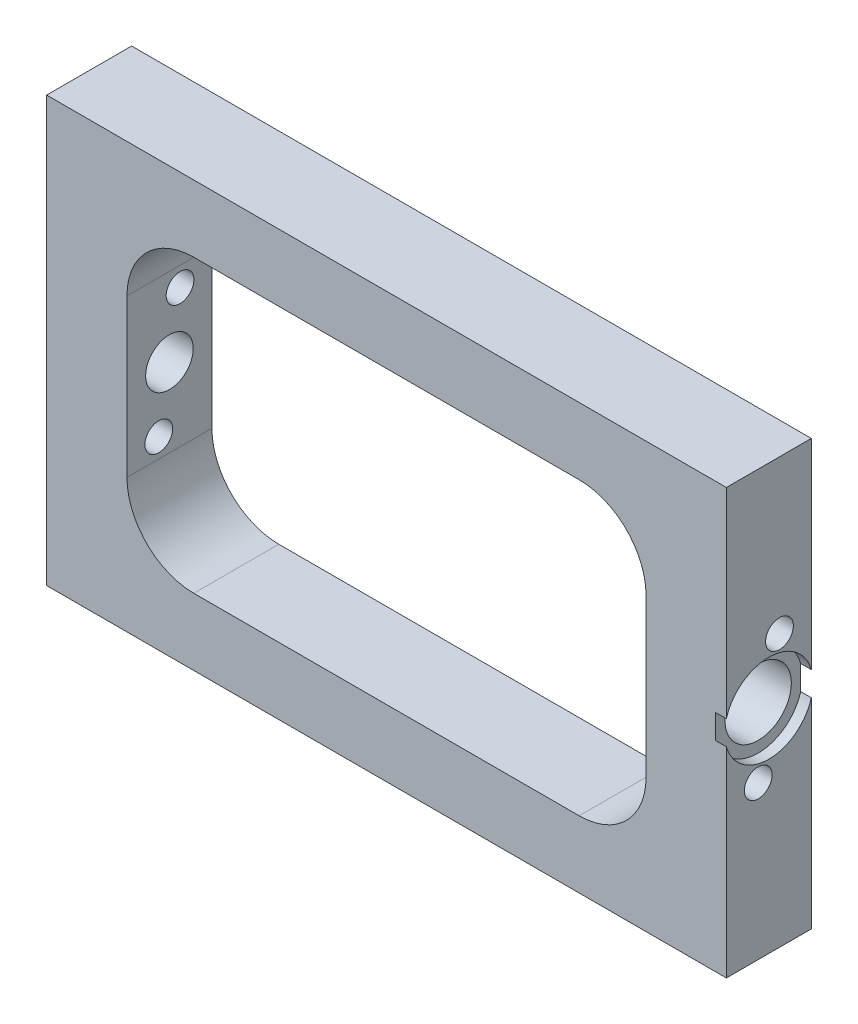
ISO-10303-21;
HEADER;
FILE_DESCRIPTION(('STEP AP214'),'2;1');
FILE_NAME('part.step','',(''),(''),'','','');
FILE_SCHEMA(('AUTOMOTIVE_DESIGN { 1 0 10303 214 1 1 1 1 }'));
ENDSEC;
DATA;
#1=APPLICATION_CONTEXT('core data for automotive mechanical design processes');
#2=APPLICATION_PROTOCOL_DEFINITION('international standard','automotive_design',2000,#1);
#3=PRODUCT_CONTEXT('',#1,'mechanical');
#4=PRODUCT('Part','Part','',(#3));
#5=PRODUCT_RELATED_PRODUCT_CATEGORY('part','',(#4));
#6=PRODUCT_DEFINITION_FORMATION('','',#4);
#7=PRODUCT_DEFINITION_CONTEXT('part definition',#1,'design');
#8=PRODUCT_DEFINITION('design','',#6,#7);
#9=PRODUCT_DEFINITION_SHAPE('','',#8);
#10=(LENGTH_UNIT() NAMED_UNIT(*) SI_UNIT(.MILLI.,.METRE.));
#11=(NAMED_UNIT(*) PLANE_ANGLE_UNIT() SI_UNIT($,.RADIAN.));
#12=(NAMED_UNIT(*) SI_UNIT($,.STERADIAN.) SOLID_ANGLE_UNIT());
#13=UNCERTAINTY_MEASURE_WITH_UNIT(LENGTH_MEASURE(1.E-05),#10,'distance_accuracy_value','');
#14=(GEOMETRIC_REPRESENTATION_CONTEXT(3) GLOBAL_UNCERTAINTY_ASSIGNED_CONTEXT((#13)) GLOBAL_UNIT_ASSIGNED_CONTEXT((#10,
#11,#12)) REPRESENTATION_CONTEXT('',''));
#15=CARTESIAN_POINT('',(0.,0.,0.));
#16=DIRECTION('',(0.,0.,1.));
#17=DIRECTION('',(1.,0.,0.));
#18=AXIS2_PLACEMENT_3D('',#15,#16,#17);
#19=CARTESIAN_POINT('',(50.8,31.75,-6.35));
#20=DIRECTION('',(1.,0.,0.));
#21=DIRECTION('',(0.,0.,-1.));
#22=AXIS2_PLACEMENT_3D('',#19,#20,#21);
#23=PLANE('',#22);
#24=CARTESIAN_POINT('',(50.8,8.85888501731454,-1.5875));
#25=DIRECTION('',(1.,0.,0.));
#26=DIRECTION('',(0.,0.,-1.));
#27=AXIS2_PLACEMENT_3D('',#24,#25,#26);
#28=CIRCLE('',#27,2.075);
#29=CARTESIAN_POINT('',(50.8,8.85888501731454,-3.6625));
#30=VERTEX_POINT('',#29);
#31=EDGE_CURVE('E286',#30,#30,#28,.F.);
#32=ORIENTED_EDGE('',*,*,#31,.T.);
#33=EDGE_LOOP('',(#32));
#34=FACE_BOUND('',#33,.T.);
#35=CARTESIAN_POINT('',(50.8,0.,0.));
#36=DIRECTION('',(1.,0.,0.));
#37=DIRECTION('',(0.,0.,-1.));
#38=AXIS2_PLACEMENT_3D('',#35,#36,#37);
#39=CIRCLE('',#38,6.604);
#40=CARTESIAN_POINT('',(50.8,1.81392282084988,-6.35));
#41=VERTEX_POINT('',#40);
#42=CARTESIAN_POINT('',(50.8,1.81392282084988,6.35));
#43=VERTEX_POINT('',#42);
#44=EDGE_CURVE('E158',#41,#43,#39,.T.);
#45=ORIENTED_EDGE('',*,*,#44,.F.);
#46=DIRECTION('',(0.,1.,0.));
#47=VECTOR('',#46,1.);
#48=CARTESIAN_POINT('',(50.8,31.75,-6.35));
#49=LINE('',#48,#47);
#50=CARTESIAN_POINT('',(50.8,31.75,-6.35));
#51=VERTEX_POINT('',#50);
#52=EDGE_CURVE('E170',#41,#51,#49,.T.);
#53=ORIENTED_EDGE('',*,*,#52,.T.);
#54=DIRECTION('',(0.,0.,1.));
#55=VECTOR('',#54,1.);
#56=CARTESIAN_POINT('',(50.8,31.75,-6.35));
#57=LINE('',#56,#55);
#58=CARTESIAN_POINT('',(50.8,31.75,6.35));
#59=VERTEX_POINT('',#58);
#60=EDGE_CURVE('E218',#51,#59,#57,.T.);
#61=ORIENTED_EDGE('',*,*,#60,.T.);
#62=DIRECTION('',(0.,1.,0.));
#63=VECTOR('',#62,1.);
#64=CARTESIAN_POINT('',(50.8,31.75,6.35));
#65=LINE('',#64,#63);
#66=EDGE_CURVE('E172',#43,#59,#65,.T.);
#67=ORIENTED_EDGE('',*,*,#66,.F.);
#68=EDGE_LOOP('',(#45,#53,#61,#67));
#69=FACE_BOUND('',#68,.T.);
#70=ADVANCED_FACE('F39',(#34,#69),#23,.T.);
#71=CARTESIAN_POINT('',(-50.801,0.,0.));
#72=DIRECTION('',(1.,0.,0.));
#73=DIRECTION('',(0.,0.,-1.));
#74=AXIS2_PLACEMENT_3D('',#71,#72,#73);
#75=CYLINDRICAL_SURFACE('',#74,4.953);
#76=CARTESIAN_POINT('',(38.8,0.,0.));
#77=DIRECTION('',(1.,0.,0.));
#78=DIRECTION('',(0.,0.,-1.));
#79=AXIS2_PLACEMENT_3D('',#76,#77,#78);
#80=CIRCLE('',#79,4.953);
#81=CARTESIAN_POINT('',(38.8,0.,-4.953));
#82=VERTEX_POINT('',#81);
#83=EDGE_CURVE('E324',#82,#82,#80,.F.);
#84=ORIENTED_EDGE('',*,*,#83,.T.);
#85=EDGE_LOOP('',(#84));
#86=FACE_BOUND('',#85,.T.);
#87=CARTESIAN_POINT('',(49.2125,0.,0.));
#88=DIRECTION('',(1.,0.,0.));
#89=DIRECTION('',(0.,0.,-1.));
#90=AXIS2_PLACEMENT_3D('',#87,#88,#89);
#91=CIRCLE('',#90,4.953);
#92=CARTESIAN_POINT('',(49.2125,0.,-4.953));
#93=VERTEX_POINT('',#92);
#94=EDGE_CURVE('E276',#93,#93,#91,.F.);
#95=ORIENTED_EDGE('',*,*,#94,.F.);
#96=EDGE_LOOP('',(#95));
#97=FACE_BOUND('',#96,.T.);
#98=ADVANCED_FACE('F407',(#86,#97),#75,.F.);
#99=CARTESIAN_POINT('',(-50.8,31.75,-6.35));
#100=DIRECTION('',(-1.,0.,0.));
#101=DIRECTION('',(0.,0.,1.));
#102=AXIS2_PLACEMENT_3D('',#99,#100,#101);
#103=PLANE('',#102);
#104=CARTESIAN_POINT('',(-50.8,8.85888501731454,-1.5875));
#105=DIRECTION('',(-1.,0.,0.));
#106=DIRECTION('',(0.,0.,1.));
#107=AXIS2_PLACEMENT_3D('',#104,#105,#106);
#108=CIRCLE('',#107,2.075);
#109=CARTESIAN_POINT('',(-50.8,8.85888501731454,0.4875));
#110=VERTEX_POINT('',#109);
#111=EDGE_CURVE('E294',#110,#110,#108,.T.);
#112=ORIENTED_EDGE('',*,*,#111,.F.);
#113=EDGE_LOOP('',(#112));
#114=FACE_BOUND('',#113,.T.);
#115=CARTESIAN_POINT('',(-50.8,-8.85888501731454,1.5875));
#116=DIRECTION('',(-1.,0.,0.));
#117=DIRECTION('',(0.,0.,1.));
#118=AXIS2_PLACEMENT_3D('',#115,#116,#117);
#119=CIRCLE('',#118,2.075);
#120=CARTESIAN_POINT('',(-50.8,-8.85888501731454,3.6625));
#121=VERTEX_POINT('',#120);
#122=EDGE_CURVE('E300',#121,#121,#119,.T.);
#123=ORIENTED_EDGE('',*,*,#122,.F.);
#124=EDGE_LOOP('',(#123));
#125=FACE_BOUND('',#124,.T.);
#126=CARTESIAN_POINT('',(-50.8,0.,0.));
#127=DIRECTION('',(-1.,0.,0.));
#128=DIRECTION('',(0.,0.,1.));
#129=AXIS2_PLACEMENT_3D('',#126,#127,#128);
#130=CIRCLE('',#129,3.556);
#131=CARTESIAN_POINT('',(-50.8,0.,3.556));
#132=VERTEX_POINT('',#131);
#133=EDGE_CURVE('E328',#132,#132,#130,.T.);
#134=ORIENTED_EDGE('',*,*,#133,.F.);
#135=EDGE_LOOP('',(#134));
#136=FACE_BOUND('',#135,.T.);
#137=DIRECTION('',(0.,-1.,0.));
#138=VECTOR('',#137,1.);
#139=CARTESIAN_POINT('',(-50.8,31.75,6.35));
#140=LINE('',#139,#138);
#141=CARTESIAN_POINT('',(-50.8,31.75,6.35));
#142=VERTEX_POINT('',#141);
#143=CARTESIAN_POINT('',(-50.8,-31.75,6.35));
#144=VERTEX_POINT('',#143);
#145=EDGE_CURVE('E197',#142,#144,#140,.T.);
#146=ORIENTED_EDGE('',*,*,#145,.F.);
#147=DIRECTION('',(0.,0.,1.));
#148=VECTOR('',#147,1.);
#149=CARTESIAN_POINT('',(-50.8,31.75,-6.35));
#150=LINE('',#149,#148);
#151=CARTESIAN_POINT('',(-50.8,31.75,-6.35));
#152=VERTEX_POINT('',#151);
#153=EDGE_CURVE('E214',#152,#142,#150,.T.);
#154=ORIENTED_EDGE('',*,*,#153,.F.);
#155=DIRECTION('',(0.,-1.,0.));
#156=VECTOR('',#155,1.);
#157=CARTESIAN_POINT('',(-50.8,31.75,-6.35));
#158=LINE('',#157,#156);
#159=CARTESIAN_POINT('',(-50.8,-31.75,-6.35));
#160=VERTEX_POINT('',#159);
#161=EDGE_CURVE('E190',#152,#160,#158,.T.);
#162=ORIENTED_EDGE('',*,*,#161,.T.);
#163=DIRECTION('',(0.,0.,1.));
#164=VECTOR('',#163,1.);
#165=CARTESIAN_POINT('',(-50.8,-31.75,-6.35));
#166=LINE('',#165,#164);
#167=EDGE_CURVE('E196',#160,#144,#166,.T.);
#168=ORIENTED_EDGE('',*,*,#167,.T.);
#169=EDGE_LOOP('',(#146,#154,#162,#168));
#170=FACE_BOUND('',#169,.T.);
#171=ADVANCED_FACE('F368',(#114,#125,#136,#170),#103,.T.);
#172=CARTESIAN_POINT('',(-50.8,31.75,-6.35));
#173=DIRECTION('',(0.,1.,0.));
#174=DIRECTION('',(0.,0.,1.));
#175=AXIS2_PLACEMENT_3D('',#172,#173,#174);
#176=PLANE('',#175);
#177=DIRECTION('',(-1.,0.,0.));
#178=VECTOR('',#177,1.);
#179=CARTESIAN_POINT('',(-50.8,31.75,6.35));
#180=LINE('',#179,#178);
#181=EDGE_CURVE('E210',#59,#142,#180,.T.);
#182=ORIENTED_EDGE('',*,*,#181,.F.);
#183=ORIENTED_EDGE('',*,*,#60,.F.);
#184=DIRECTION('',(-1.,0.,0.));
#185=VECTOR('',#184,1.);
#186=CARTESIAN_POINT('',(-50.8,31.75,-6.35));
#187=LINE('',#186,#185);
#188=EDGE_CURVE('E181',#51,#152,#187,.T.);
#189=ORIENTED_EDGE('',*,*,#188,.T.);
#190=ORIENTED_EDGE('',*,*,#153,.T.);
#191=EDGE_LOOP('',(#182,#183,#189,#190));
#192=FACE_BOUND('',#191,.T.);
#193=ADVANCED_FACE('F374',(#192),#176,.T.);
#194=CARTESIAN_POINT('',(50.8,-8.85888501731454,1.5875));
#195=DIRECTION('',(1.,0.,0.));
#196=DIRECTION('',(0.,0.,-1.));
#197=AXIS2_PLACEMENT_3D('',#194,#195,#196);
#198=CIRCLE('',#197,2.075);
#199=CARTESIAN_POINT('',(50.8,-8.85888501731454,-0.487499999999996));
#200=VERTEX_POINT('',#199);
#201=EDGE_CURVE('E303',#200,#200,#198,.F.);
#202=ORIENTED_EDGE('',*,*,#201,.T.);
#203=EDGE_LOOP('',(#202));
#204=FACE_BOUND('',#203,.T.);
#205=CARTESIAN_POINT('',(50.8,-1.81392282084988,6.35));
#206=VERTEX_POINT('',#205);
#207=CARTESIAN_POINT('',(50.8,-1.81392282084988,-6.35));
#208=VERTEX_POINT('',#207);
#209=EDGE_CURVE('E175',#206,#208,#39,.T.);
#210=ORIENTED_EDGE('',*,*,#209,.F.);
#211=CARTESIAN_POINT('',(50.8,-31.75,6.35));
#212=VERTEX_POINT('',#211);
#213=EDGE_CURVE('E206',#212,#206,#65,.T.);
#214=ORIENTED_EDGE('',*,*,#213,.F.);
#215=DIRECTION('',(0.,0.,1.));
#216=VECTOR('',#215,1.);
#217=CARTESIAN_POINT('',(50.8,-31.75,-6.35));
#218=LINE('',#217,#216);
#219=CARTESIAN_POINT('',(50.8,-31.75,-6.35));
#220=VERTEX_POINT('',#219);
#221=EDGE_CURVE('E221',#220,#212,#218,.T.);
#222=ORIENTED_EDGE('',*,*,#221,.F.);
#223=EDGE_CURVE('E183',#220,#208,#49,.T.);
#224=ORIENTED_EDGE('',*,*,#223,.T.);
#225=EDGE_LOOP('',(#210,#214,#222,#224));
#226=FACE_BOUND('',#225,.T.);
#227=ADVANCED_FACE('F409',(#204,#226),#23,.T.);
#228=CARTESIAN_POINT('',(-50.8,-31.75,-6.35));
#229=DIRECTION('',(0.,-1.,0.));
#230=DIRECTION('',(0.,0.,-1.));
#231=AXIS2_PLACEMENT_3D('',#228,#229,#230);
#232=PLANE('',#231);
#233=DIRECTION('',(1.,0.,0.));
#234=VECTOR('',#233,1.);
#235=CARTESIAN_POINT('',(-50.8,-31.75,6.35));
#236=LINE('',#235,#234);
#237=EDGE_CURVE('E201',#144,#212,#236,.T.);
#238=ORIENTED_EDGE('',*,*,#237,.F.);
#239=ORIENTED_EDGE('',*,*,#167,.F.);
#240=DIRECTION('',(1.,0.,0.));
#241=VECTOR('',#240,1.);
#242=CARTESIAN_POINT('',(-50.8,-31.75,-6.35));
#243=LINE('',#242,#241);
#244=EDGE_CURVE('E184',#160,#220,#243,.T.);
#245=ORIENTED_EDGE('',*,*,#244,.T.);
#246=ORIENTED_EDGE('',*,*,#221,.T.);
#247=EDGE_LOOP('',(#238,#239,#245,#246));
#248=FACE_BOUND('',#247,.T.);
#249=ADVANCED_FACE('F418',(#248),#232,.T.);
#250=CARTESIAN_POINT('',(0.,0.,-6.35));
#251=DIRECTION('',(0.,0.,1.));
#252=DIRECTION('',(1.,0.,0.));
#253=AXIS2_PLACEMENT_3D('',#250,#251,#252);
#254=PLANE('',#253);
#255=DIRECTION('',(0.,1.,0.));
#256=VECTOR('',#255,1.);
#257=CARTESIAN_POINT('',(38.8,-21.75,-6.35));
#258=LINE('',#257,#256);
#259=CARTESIAN_POINT('',(38.8,-11.75,-6.35));
#260=VERTEX_POINT('',#259);
#261=CARTESIAN_POINT('',(38.8,11.75,-6.35));
#262=VERTEX_POINT('',#261);
#263=EDGE_CURVE('E345',#260,#262,#258,.T.);
#264=ORIENTED_EDGE('',*,*,#263,.T.);
#265=CARTESIAN_POINT('',(28.8,11.75,-6.35));
#266=DIRECTION('',(0.,0.,1.));
#267=DIRECTION('',(1.,0.,0.));
#268=AXIS2_PLACEMENT_3D('',#265,#266,#267);
#269=CIRCLE('',#268,10.);
#270=CARTESIAN_POINT('',(28.8,21.75,-6.35));
#271=VERTEX_POINT('',#270);
#272=EDGE_CURVE('E261',#262,#271,#269,.T.);
#273=ORIENTED_EDGE('',*,*,#272,.T.);
#274=DIRECTION('',(-1.,0.,0.));
#275=VECTOR('',#274,1.);
#276=CARTESIAN_POINT('',(38.8,21.75,-6.35));
#277=LINE('',#276,#275);
#278=CARTESIAN_POINT('',(-28.8,21.75,-6.35));
#279=VERTEX_POINT('',#278);
#280=EDGE_CURVE('E202',#271,#279,#277,.T.);
#281=ORIENTED_EDGE('',*,*,#280,.T.);
#282=CARTESIAN_POINT('',(-28.8,11.75,-6.35));
#283=DIRECTION('',(0.,0.,1.));
#284=DIRECTION('',(1.,0.,0.));
#285=AXIS2_PLACEMENT_3D('',#282,#283,#284);
#286=CIRCLE('',#285,10.);
#287=CARTESIAN_POINT('',(-38.8,11.75,-6.35));
#288=VERTEX_POINT('',#287);
#289=EDGE_CURVE('E267',#279,#288,#286,.T.);
#290=ORIENTED_EDGE('',*,*,#289,.T.);
#291=DIRECTION('',(0.,-1.,0.));
#292=VECTOR('',#291,1.);
#293=CARTESIAN_POINT('',(-38.8,-21.75,-6.35));
#294=LINE('',#293,#292);
#295=CARTESIAN_POINT('',(-38.8,-11.75,-6.35));
#296=VERTEX_POINT('',#295);
#297=EDGE_CURVE('E337',#288,#296,#294,.T.);
#298=ORIENTED_EDGE('',*,*,#297,.T.);
#299=CARTESIAN_POINT('',(-28.8,-11.75,-6.35));
#300=DIRECTION('',(0.,0.,1.));
#301=DIRECTION('',(1.,0.,0.));
#302=AXIS2_PLACEMENT_3D('',#299,#300,#301);
#303=CIRCLE('',#302,10.);
#304=CARTESIAN_POINT('',(-28.8,-21.75,-6.35));
#305=VERTEX_POINT('',#304);
#306=EDGE_CURVE('E273',#296,#305,#303,.T.);
#307=ORIENTED_EDGE('',*,*,#306,.T.);
#308=DIRECTION('',(1.,0.,0.));
#309=VECTOR('',#308,1.);
#310=CARTESIAN_POINT('',(38.8,-21.75,-6.35));
#311=LINE('',#310,#309);
#312=CARTESIAN_POINT('',(28.8,-21.75,-6.35));
#313=VERTEX_POINT('',#312);
#314=EDGE_CURVE('E340',#305,#313,#311,.T.);
#315=ORIENTED_EDGE('',*,*,#314,.T.);
#316=CARTESIAN_POINT('',(28.8,-11.75,-6.35));
#317=DIRECTION('',(0.,0.,1.));
#318=DIRECTION('',(1.,0.,0.));
#319=AXIS2_PLACEMENT_3D('',#316,#317,#318);
#320=CIRCLE('',#319,10.);
#321=EDGE_CURVE('E255',#313,#260,#320,.T.);
#322=ORIENTED_EDGE('',*,*,#321,.T.);
#323=EDGE_LOOP('',(#264,#273,#281,#290,#298,#307,#315,#322));
#324=FACE_BOUND('',#323,.T.);
#325=DIRECTION('',(0.,1.,0.));
#326=VECTOR('',#325,1.);
#327=CARTESIAN_POINT('',(49.2125,0.,-6.35));
#328=LINE('',#327,#326);
#329=CARTESIAN_POINT('',(49.2125,-1.81392282084988,-6.35));
#330=VERTEX_POINT('',#329);
#331=CARTESIAN_POINT('',(49.2125,1.81392282084988,-6.35));
#332=VERTEX_POINT('',#331);
#333=EDGE_CURVE('E165',#330,#332,#328,.T.);
#334=ORIENTED_EDGE('',*,*,#333,.F.);
#335=DIRECTION('',(1.,0.,0.));
#336=VECTOR('',#335,1.);
#337=CARTESIAN_POINT('',(49.2125,-1.81392282084988,-6.35));
#338=LINE('',#337,#336);
#339=EDGE_CURVE('E164',#330,#208,#338,.T.);
#340=ORIENTED_EDGE('',*,*,#339,.T.);
#341=ORIENTED_EDGE('',*,*,#223,.F.);
#342=ORIENTED_EDGE('',*,*,#244,.F.);
#343=ORIENTED_EDGE('',*,*,#161,.F.);
#344=ORIENTED_EDGE('',*,*,#188,.F.);
#345=ORIENTED_EDGE('',*,*,#52,.F.);
#346=DIRECTION('',(1.,0.,0.));
#347=VECTOR('',#346,1.);
#348=CARTESIAN_POINT('',(49.2125,1.81392282084988,-6.35));
#349=LINE('',#348,#347);
#350=EDGE_CURVE('E155',#41,#332,#349,.F.);
#351=ORIENTED_EDGE('',*,*,#350,.T.);
#352=EDGE_LOOP('',(#334,#340,#341,#342,#343,#344,#345,#351));
#353=FACE_BOUND('',#352,.T.);
#354=ADVANCED_FACE('F178',(#324,#353),#254,.F.);
#355=CARTESIAN_POINT('',(0.,0.,6.35));
#356=DIRECTION('',(0.,0.,1.));
#357=DIRECTION('',(1.,0.,0.));
#358=AXIS2_PLACEMENT_3D('',#355,#356,#357);
#359=PLANE('',#358);
#360=DIRECTION('',(1.,0.,0.));
#361=VECTOR('',#360,1.);
#362=CARTESIAN_POINT('',(49.2125,-1.81392282084988,6.35));
#363=LINE('',#362,#361);
#364=CARTESIAN_POINT('',(49.2125,-1.81392282084988,6.35));
#365=VERTEX_POINT('',#364);
#366=EDGE_CURVE('E11',#365,#206,#363,.T.);
#367=ORIENTED_EDGE('',*,*,#366,.F.);
#368=DIRECTION('',(0.,1.,0.));
#369=VECTOR('',#368,1.);
#370=CARTESIAN_POINT('',(49.2125,0.,6.35));
#371=LINE('',#370,#369);
#372=CARTESIAN_POINT('',(49.2125,1.81392282084988,6.35));
#373=VERTEX_POINT('',#372);
#374=EDGE_CURVE('E280',#365,#373,#371,.T.);
#375=ORIENTED_EDGE('',*,*,#374,.T.);
#376=DIRECTION('',(1.,0.,0.));
#377=VECTOR('',#376,1.);
#378=CARTESIAN_POINT('',(49.2125,1.81392282084988,6.35));
#379=LINE('',#378,#377);
#380=EDGE_CURVE('E49',#43,#373,#379,.F.);
#381=ORIENTED_EDGE('',*,*,#380,.F.);
#382=ORIENTED_EDGE('',*,*,#66,.T.);
#383=ORIENTED_EDGE('',*,*,#181,.T.);
#384=ORIENTED_EDGE('',*,*,#145,.T.);
#385=ORIENTED_EDGE('',*,*,#237,.T.);
#386=ORIENTED_EDGE('',*,*,#213,.T.);
#387=EDGE_LOOP('',(#367,#375,#381,#382,#383,#384,#385,#386));
#388=FACE_BOUND('',#387,.T.);
#389=DIRECTION('',(0.,-1.,0.));
#390=VECTOR('',#389,1.);
#391=CARTESIAN_POINT('',(-38.8,-21.75,6.35));
#392=LINE('',#391,#390);
#393=CARTESIAN_POINT('',(-38.8,11.75,6.35));
#394=VERTEX_POINT('',#393);
#395=CARTESIAN_POINT('',(-38.8,-11.75,6.35));
#396=VERTEX_POINT('',#395);
#397=EDGE_CURVE('E336',#394,#396,#392,.T.);
#398=ORIENTED_EDGE('',*,*,#397,.F.);
#399=CARTESIAN_POINT('',(-28.8,11.75,6.35));
#400=DIRECTION('',(0.,0.,1.));
#401=DIRECTION('',(1.,0.,0.));
#402=AXIS2_PLACEMENT_3D('',#399,#400,#401);
#403=CIRCLE('',#402,10.);
#404=CARTESIAN_POINT('',(-28.8,21.75,6.35));
#405=VERTEX_POINT('',#404);
#406=EDGE_CURVE('E264',#394,#405,#403,.F.);
#407=ORIENTED_EDGE('',*,*,#406,.T.);
#408=DIRECTION('',(-1.,0.,0.));
#409=VECTOR('',#408,1.);
#410=CARTESIAN_POINT('',(38.8,21.75,6.35));
#411=LINE('',#410,#409);
#412=CARTESIAN_POINT('',(28.8,21.75,6.35));
#413=VERTEX_POINT('',#412);
#414=EDGE_CURVE('E341',#413,#405,#411,.T.);
#415=ORIENTED_EDGE('',*,*,#414,.F.);
#416=CARTESIAN_POINT('',(28.8,11.75,6.35));
#417=DIRECTION('',(0.,0.,1.));
#418=DIRECTION('',(1.,0.,0.));
#419=AXIS2_PLACEMENT_3D('',#416,#417,#418);
#420=CIRCLE('',#419,10.);
#421=CARTESIAN_POINT('',(38.8,11.75,6.35));
#422=VERTEX_POINT('',#421);
#423=EDGE_CURVE('E258',#413,#422,#420,.F.);
#424=ORIENTED_EDGE('',*,*,#423,.T.);
#425=DIRECTION('',(0.,1.,0.));
#426=VECTOR('',#425,1.);
#427=CARTESIAN_POINT('',(38.8,-21.75,6.35));
#428=LINE('',#427,#426);
#429=CARTESIAN_POINT('',(38.8,-11.75,6.35));
#430=VERTEX_POINT('',#429);
#431=EDGE_CURVE('E358',#430,#422,#428,.T.);
#432=ORIENTED_EDGE('',*,*,#431,.F.);
#433=CARTESIAN_POINT('',(28.8,-11.75,6.35));
#434=DIRECTION('',(0.,0.,1.));
#435=DIRECTION('',(1.,0.,0.));
#436=AXIS2_PLACEMENT_3D('',#433,#434,#435);
#437=CIRCLE('',#436,10.);
#438=CARTESIAN_POINT('',(28.8,-21.75,6.35));
#439=VERTEX_POINT('',#438);
#440=EDGE_CURVE('E252',#430,#439,#437,.F.);
#441=ORIENTED_EDGE('',*,*,#440,.T.);
#442=DIRECTION('',(1.,0.,0.));
#443=VECTOR('',#442,1.);
#444=CARTESIAN_POINT('',(38.8,-21.75,6.35));
#445=LINE('',#444,#443);
#446=CARTESIAN_POINT('',(-28.8,-21.75,6.35));
#447=VERTEX_POINT('',#446);
#448=EDGE_CURVE('E354',#447,#439,#445,.T.);
#449=ORIENTED_EDGE('',*,*,#448,.F.);
#450=CARTESIAN_POINT('',(-28.8,-11.75,6.35));
#451=DIRECTION('',(0.,0.,1.));
#452=DIRECTION('',(1.,0.,0.));
#453=AXIS2_PLACEMENT_3D('',#450,#451,#452);
#454=CIRCLE('',#453,10.);
#455=EDGE_CURVE('E270',#447,#396,#454,.F.);
#456=ORIENTED_EDGE('',*,*,#455,.T.);
#457=EDGE_LOOP('',(#398,#407,#415,#424,#432,#441,#449,#456));
#458=FACE_BOUND('',#457,.T.);
#459=ADVANCED_FACE('F377',(#388,#458),#359,.T.);
#460=CARTESIAN_POINT('',(-38.8,-21.75,-6.35));
#461=DIRECTION('',(-1.,0.,0.));
#462=DIRECTION('',(0.,0.,1.));
#463=AXIS2_PLACEMENT_3D('',#460,#461,#462);
#464=PLANE('',#463);
#465=CARTESIAN_POINT('',(-38.8,8.85888501731454,-1.5875));
#466=DIRECTION('',(-1.,0.,0.));
#467=DIRECTION('',(0.,0.,1.));
#468=AXIS2_PLACEMENT_3D('',#465,#466,#467);
#469=CIRCLE('',#468,2.075);
#470=CARTESIAN_POINT('',(-38.8,8.85888501731454,0.4875));
#471=VERTEX_POINT('',#470);
#472=EDGE_CURVE('E310',#471,#471,#469,.T.);
#473=ORIENTED_EDGE('',*,*,#472,.T.);
#474=EDGE_LOOP('',(#473));
#475=FACE_BOUND('',#474,.T.);
#476=CARTESIAN_POINT('',(-38.8,-8.85888501731454,1.5875));
#477=DIRECTION('',(-1.,0.,0.));
#478=DIRECTION('',(0.,0.,1.));
#479=AXIS2_PLACEMENT_3D('',#476,#477,#478);
#480=CIRCLE('',#479,2.075);
#481=CARTESIAN_POINT('',(-38.8,-8.85888501731454,3.6625));
#482=VERTEX_POINT('',#481);
#483=EDGE_CURVE('E285',#482,#482,#480,.T.);
#484=ORIENTED_EDGE('',*,*,#483,.T.);
#485=EDGE_LOOP('',(#484));
#486=FACE_BOUND('',#485,.T.);
#487=CARTESIAN_POINT('',(-38.8,0.,0.));
#488=DIRECTION('',(-1.,0.,0.));
#489=DIRECTION('',(0.,0.,1.));
#490=AXIS2_PLACEMENT_3D('',#487,#488,#489);
#491=CIRCLE('',#490,3.556);
#492=CARTESIAN_POINT('',(-38.8,0.,3.556));
#493=VERTEX_POINT('',#492);
#494=EDGE_CURVE('E332',#493,#493,#491,.T.);
#495=ORIENTED_EDGE('',*,*,#494,.T.);
#496=EDGE_LOOP('',(#495));
#497=FACE_BOUND('',#496,.T.);
#498=ORIENTED_EDGE('',*,*,#297,.F.);
#499=DIRECTION('',(0.,0.,1.));
#500=VECTOR('',#499,1.);
#501=CARTESIAN_POINT('',(-38.8,11.75,6.35));
#502=LINE('',#501,#500);
#503=EDGE_CURVE('E248',#288,#394,#502,.T.);
#504=ORIENTED_EDGE('',*,*,#503,.T.);
#505=ORIENTED_EDGE('',*,*,#397,.T.);
#506=DIRECTION('',(0.,0.,1.));
#507=VECTOR('',#506,1.);
#508=CARTESIAN_POINT('',(-38.8,-11.75,-6.35));
#509=LINE('',#508,#507);
#510=EDGE_CURVE('E65',#396,#296,#509,.F.);
#511=ORIENTED_EDGE('',*,*,#510,.T.);
#512=EDGE_LOOP('',(#498,#504,#505,#511));
#513=FACE_BOUND('',#512,.T.);
#514=ADVANCED_FACE('F448',(#475,#486,#497,#513),#464,.F.);
#515=CARTESIAN_POINT('',(38.8,21.75,-6.35));
#516=DIRECTION('',(0.,1.,0.));
#517=DIRECTION('',(0.,0.,1.));
#518=AXIS2_PLACEMENT_3D('',#515,#516,#517);
#519=PLANE('',#518);
#520=ORIENTED_EDGE('',*,*,#280,.F.);
#521=DIRECTION('',(0.,0.,1.));
#522=VECTOR('',#521,1.);
#523=CARTESIAN_POINT('',(28.8,21.75,6.35));
#524=LINE('',#523,#522);
#525=EDGE_CURVE('E242',#271,#413,#524,.T.);
#526=ORIENTED_EDGE('',*,*,#525,.T.);
#527=ORIENTED_EDGE('',*,*,#414,.T.);
#528=DIRECTION('',(0.,0.,1.));
#529=VECTOR('',#528,1.);
#530=CARTESIAN_POINT('',(-28.8,21.75,-6.35));
#531=LINE('',#530,#529);
#532=EDGE_CURVE('E239',#405,#279,#531,.F.);
#533=ORIENTED_EDGE('',*,*,#532,.T.);
#534=EDGE_LOOP('',(#520,#526,#527,#533));
#535=FACE_BOUND('',#534,.T.);
#536=ADVANCED_FACE('F445',(#535),#519,.F.);
#537=CARTESIAN_POINT('',(38.8,-21.75,-6.35));
#538=DIRECTION('',(1.,0.,0.));
#539=DIRECTION('',(0.,0.,-1.));
#540=AXIS2_PLACEMENT_3D('',#537,#538,#539);
#541=PLANE('',#540);
#542=CARTESIAN_POINT('',(38.8,8.85888501731454,-1.5875));
#543=DIRECTION('',(1.,0.,0.));
#544=DIRECTION('',(0.,0.,-1.));
#545=AXIS2_PLACEMENT_3D('',#542,#543,#544);
#546=CIRCLE('',#545,2.075);
#547=CARTESIAN_POINT('',(38.8,8.85888501731454,-3.6625));
#548=VERTEX_POINT('',#547);
#549=EDGE_CURVE('E43',#548,#548,#546,.T.);
#550=ORIENTED_EDGE('',*,*,#549,.T.);
#551=EDGE_LOOP('',(#550));
#552=FACE_BOUND('',#551,.T.);
#553=CARTESIAN_POINT('',(38.8,-8.85888501731454,1.5875));
#554=DIRECTION('',(1.,0.,0.));
#555=DIRECTION('',(0.,0.,-1.));
#556=AXIS2_PLACEMENT_3D('',#553,#554,#555);
#557=CIRCLE('',#556,2.075);
#558=CARTESIAN_POINT('',(38.8,-8.85888501731454,-0.487499999999996));
#559=VERTEX_POINT('',#558);
#560=EDGE_CURVE('E282',#559,#559,#557,.T.);
#561=ORIENTED_EDGE('',*,*,#560,.T.);
#562=EDGE_LOOP('',(#561));
#563=FACE_BOUND('',#562,.T.);
#564=ORIENTED_EDGE('',*,*,#83,.F.);
#565=EDGE_LOOP('',(#564));
#566=FACE_BOUND('',#565,.T.);
#567=ORIENTED_EDGE('',*,*,#263,.F.);
#568=DIRECTION('',(0.,0.,1.));
#569=VECTOR('',#568,1.);
#570=CARTESIAN_POINT('',(38.8,-11.75,6.35));
#571=LINE('',#570,#569);
#572=EDGE_CURVE('E228',#260,#430,#571,.T.);
#573=ORIENTED_EDGE('',*,*,#572,.T.);
#574=ORIENTED_EDGE('',*,*,#431,.T.);
#575=DIRECTION('',(0.,0.,1.));
#576=VECTOR('',#575,1.);
#577=CARTESIAN_POINT('',(38.8,11.75,-6.35));
#578=LINE('',#577,#576);
#579=EDGE_CURVE('E217',#422,#262,#578,.F.);
#580=ORIENTED_EDGE('',*,*,#579,.T.);
#581=EDGE_LOOP('',(#567,#573,#574,#580));
#582=FACE_BOUND('',#581,.T.);
#583=ADVANCED_FACE('F387',(#552,#563,#566,#582),#541,.F.);
#584=CARTESIAN_POINT('',(38.8,-21.75,-6.35));
#585=DIRECTION('',(0.,-1.,0.));
#586=DIRECTION('',(0.,0.,-1.));
#587=AXIS2_PLACEMENT_3D('',#584,#585,#586);
#588=PLANE('',#587);
#589=ORIENTED_EDGE('',*,*,#448,.T.);
#590=DIRECTION('',(0.,0.,1.));
#591=VECTOR('',#590,1.);
#592=CARTESIAN_POINT('',(28.8,-21.75,-6.35));
#593=LINE('',#592,#591);
#594=EDGE_CURVE('E236',#439,#313,#593,.F.);
#595=ORIENTED_EDGE('',*,*,#594,.T.);
#596=ORIENTED_EDGE('',*,*,#314,.F.);
#597=DIRECTION('',(0.,0.,1.));
#598=VECTOR('',#597,1.);
#599=CARTESIAN_POINT('',(-28.8,-21.75,6.35));
#600=LINE('',#599,#598);
#601=EDGE_CURVE('E232',#305,#447,#600,.T.);
#602=ORIENTED_EDGE('',*,*,#601,.T.);
#603=EDGE_LOOP('',(#589,#595,#596,#602));
#604=FACE_BOUND('',#603,.T.);
#605=ADVANCED_FACE('F452',(#604),#588,.F.);
#606=CARTESIAN_POINT('',(28.8,-11.75,-6.35));
#607=DIRECTION('',(0.,0.,-1.));
#608=DIRECTION('',(-1.,0.,0.));
#609=AXIS2_PLACEMENT_3D('',#606,#607,#608);
#610=CYLINDRICAL_SURFACE('',#609,10.);
#611=ORIENTED_EDGE('',*,*,#321,.F.);
#612=ORIENTED_EDGE('',*,*,#594,.F.);
#613=ORIENTED_EDGE('',*,*,#440,.F.);
#614=ORIENTED_EDGE('',*,*,#572,.F.);
#615=EDGE_LOOP('',(#611,#612,#613,#614));
#616=FACE_BOUND('',#615,.T.);
#617=ADVANCED_FACE('F455',(#616),#610,.F.);
#618=CARTESIAN_POINT('',(28.8,11.75,-6.35));
#619=DIRECTION('',(0.,0.,-1.));
#620=DIRECTION('',(-1.,0.,0.));
#621=AXIS2_PLACEMENT_3D('',#618,#619,#620);
#622=CYLINDRICAL_SURFACE('',#621,10.);
#623=ORIENTED_EDGE('',*,*,#272,.F.);
#624=ORIENTED_EDGE('',*,*,#579,.F.);
#625=ORIENTED_EDGE('',*,*,#423,.F.);
#626=ORIENTED_EDGE('',*,*,#525,.F.);
#627=EDGE_LOOP('',(#623,#624,#625,#626));
#628=FACE_BOUND('',#627,.T.);
#629=ADVANCED_FACE('F493',(#628),#622,.F.);
#630=CARTESIAN_POINT('',(-28.8,11.75,-6.35));
#631=DIRECTION('',(0.,0.,-1.));
#632=DIRECTION('',(-1.,0.,0.));
#633=AXIS2_PLACEMENT_3D('',#630,#631,#632);
#634=CYLINDRICAL_SURFACE('',#633,10.);
#635=ORIENTED_EDGE('',*,*,#289,.F.);
#636=ORIENTED_EDGE('',*,*,#532,.F.);
#637=ORIENTED_EDGE('',*,*,#406,.F.);
#638=ORIENTED_EDGE('',*,*,#503,.F.);
#639=EDGE_LOOP('',(#635,#636,#637,#638));
#640=FACE_BOUND('',#639,.T.);
#641=ADVANCED_FACE('F501',(#640),#634,.F.);
#642=CARTESIAN_POINT('',(-28.8,-11.75,-6.35));
#643=DIRECTION('',(0.,0.,-1.));
#644=DIRECTION('',(-1.,0.,0.));
#645=AXIS2_PLACEMENT_3D('',#642,#643,#644);
#646=CYLINDRICAL_SURFACE('',#645,10.);
#647=ORIENTED_EDGE('',*,*,#306,.F.);
#648=ORIENTED_EDGE('',*,*,#510,.F.);
#649=ORIENTED_EDGE('',*,*,#455,.F.);
#650=ORIENTED_EDGE('',*,*,#601,.F.);
#651=EDGE_LOOP('',(#647,#648,#649,#650));
#652=FACE_BOUND('',#651,.T.);
#653=ADVANCED_FACE('F41',(#652),#646,.F.);
#654=CARTESIAN_POINT('',(60.8578868555974,0.,0.));
#655=DIRECTION('',(-1.,0.,0.));
#656=DIRECTION('',(0.,0.,1.));
#657=AXIS2_PLACEMENT_3D('',#654,#655,#656);
#658=CYLINDRICAL_SURFACE('',#657,3.556);
#659=ORIENTED_EDGE('',*,*,#133,.T.);
#660=EDGE_LOOP('',(#659));
#661=FACE_BOUND('',#660,.T.);
#662=ORIENTED_EDGE('',*,*,#494,.F.);
#663=EDGE_LOOP('',(#662));
#664=FACE_BOUND('',#663,.T.);
#665=ADVANCED_FACE('F440',(#661,#664),#658,.F.);
#666=CARTESIAN_POINT('',(49.2125,0.,0.));
#667=DIRECTION('',(1.,0.,0.));
#668=DIRECTION('',(0.,0.,-1.));
#669=AXIS2_PLACEMENT_3D('',#666,#667,#668);
#670=CYLINDRICAL_SURFACE('',#669,6.604);
#671=CARTESIAN_POINT('',(49.2125,0.,0.));
#672=DIRECTION('',(1.,0.,0.));
#673=DIRECTION('',(0.,0.,-1.));
#674=AXIS2_PLACEMENT_3D('',#671,#672,#673);
#675=CIRCLE('',#674,6.604);
#676=EDGE_CURVE('E174',#365,#330,#675,.T.);
#677=ORIENTED_EDGE('',*,*,#676,.F.);
#678=ORIENTED_EDGE('',*,*,#366,.T.);
#679=ORIENTED_EDGE('',*,*,#209,.T.);
#680=ORIENTED_EDGE('',*,*,#339,.F.);
#681=EDGE_LOOP('',(#677,#678,#679,#680));
#682=FACE_BOUND('',#681,.T.);
#683=ADVANCED_FACE('F431',(#682),#670,.F.);
#684=ORIENTED_EDGE('',*,*,#44,.T.);
#685=ORIENTED_EDGE('',*,*,#380,.T.);
#686=EDGE_CURVE('E57',#332,#373,#675,.T.);
#687=ORIENTED_EDGE('',*,*,#686,.F.);
#688=ORIENTED_EDGE('',*,*,#350,.F.);
#689=EDGE_LOOP('',(#684,#685,#687,#688));
#690=FACE_BOUND('',#689,.T.);
#691=ADVANCED_FACE('F157',(#690),#670,.F.);
#692=CARTESIAN_POINT('',(49.2125,0.,0.));
#693=DIRECTION('',(1.,0.,0.));
#694=DIRECTION('',(0.,0.,-1.));
#695=AXIS2_PLACEMENT_3D('',#692,#693,#694);
#696=PLANE('',#695);
#697=ORIENTED_EDGE('',*,*,#94,.T.);
#698=EDGE_LOOP('',(#697));
#699=FACE_BOUND('',#698,.T.);
#700=ORIENTED_EDGE('',*,*,#333,.T.);
#701=ORIENTED_EDGE('',*,*,#686,.T.);
#702=ORIENTED_EDGE('',*,*,#374,.F.);
#703=ORIENTED_EDGE('',*,*,#676,.T.);
#704=EDGE_LOOP('',(#700,#701,#702,#703));
#705=FACE_BOUND('',#704,.T.);
#706=ADVANCED_FACE('F402',(#699,#705),#696,.T.);
#707=CARTESIAN_POINT('',(56.6689862838483,-8.85888501731454,1.5875));
#708=DIRECTION('',(-1.,0.,0.));
#709=DIRECTION('',(0.,0.,1.));
#710=AXIS2_PLACEMENT_3D('',#707,#708,#709);
#711=CYLINDRICAL_SURFACE('',#710,2.075);
#712=ORIENTED_EDGE('',*,*,#201,.F.);
#713=EDGE_LOOP('',(#712));
#714=FACE_BOUND('',#713,.T.);
#715=ORIENTED_EDGE('',*,*,#560,.F.);
#716=EDGE_LOOP('',(#715));
#717=FACE_BOUND('',#716,.T.);
#718=ADVANCED_FACE('F392',(#714,#717),#711,.F.);
#719=CARTESIAN_POINT('',(56.6689862838483,8.85888501731454,-1.5875));
#720=DIRECTION('',(-1.,0.,0.));
#721=DIRECTION('',(0.,0.,1.));
#722=AXIS2_PLACEMENT_3D('',#719,#720,#721);
#723=CYLINDRICAL_SURFACE('',#722,2.075);
#724=ORIENTED_EDGE('',*,*,#31,.F.);
#725=EDGE_LOOP('',(#724));
#726=FACE_BOUND('',#725,.T.);
#727=ORIENTED_EDGE('',*,*,#549,.F.);
#728=EDGE_LOOP('',(#727));
#729=FACE_BOUND('',#728,.T.);
#730=ADVANCED_FACE('F389',(#726,#729),#723,.F.);
#731=ORIENTED_EDGE('',*,*,#122,.T.);
#732=EDGE_LOOP('',(#731));
#733=FACE_BOUND('',#732,.T.);
#734=ORIENTED_EDGE('',*,*,#483,.F.);
#735=EDGE_LOOP('',(#734));
#736=FACE_BOUND('',#735,.T.);
#737=ADVANCED_FACE('F391',(#733,#736),#711,.F.);
#738=ORIENTED_EDGE('',*,*,#111,.T.);
#739=EDGE_LOOP('',(#738));
#740=FACE_BOUND('',#739,.T.);
#741=ORIENTED_EDGE('',*,*,#472,.F.);
#742=EDGE_LOOP('',(#741));
#743=FACE_BOUND('',#742,.T.);
#744=ADVANCED_FACE('F395',(#740,#743),#723,.F.);
#745=CLOSED_SHELL('',(#70,#98,#171,#193,#227,#249,#354,#459,#514,#536,#583,#605,#617,#629,#641,
#653,#665,#683,#691,#706,#718,#730,#737,#744));
#746=MANIFOLD_SOLID_BREP('B2',#745);
#747=ADVANCED_BREP_SHAPE_REPRESENTATION('',(#18,#746),#14);
#748=SHAPE_DEFINITION_REPRESENTATION(#9,#747);
ENDSEC;
END-ISO-10303-21;
